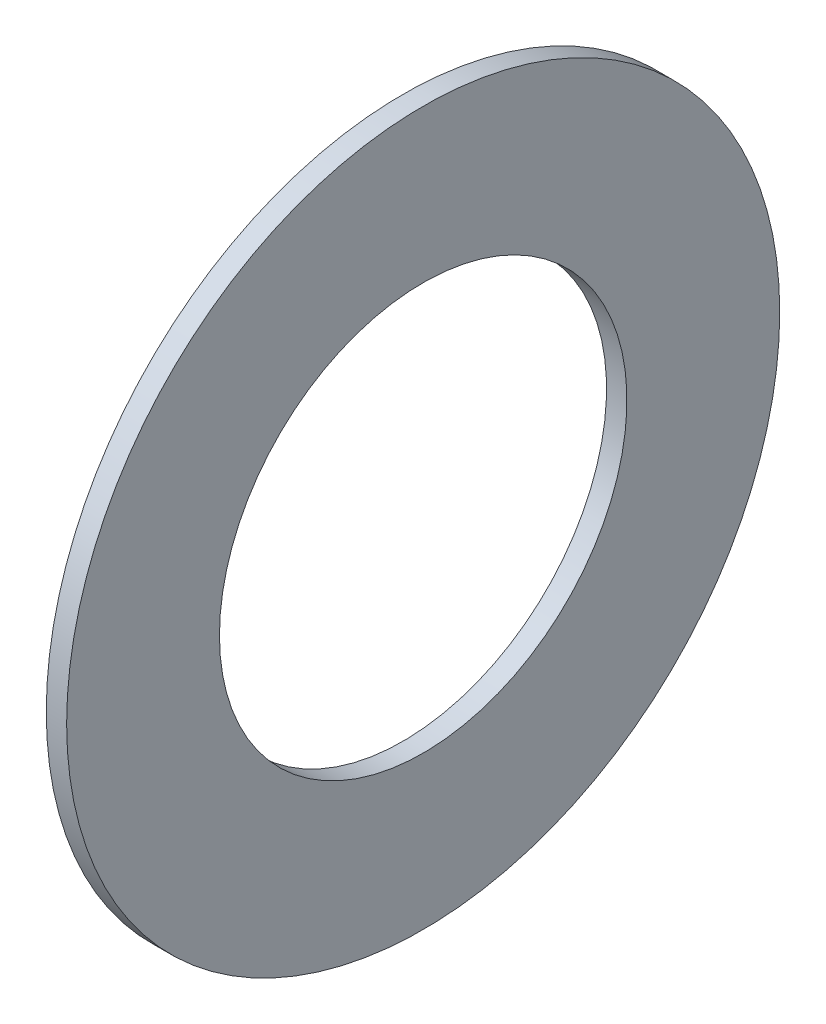
ISO-10303-21;
HEADER;
FILE_DESCRIPTION(('STEP AP214'),'2;1');
FILE_NAME('part.step','',(''),(''),'','','');
FILE_SCHEMA(('AUTOMOTIVE_DESIGN { 1 0 10303 214 1 1 1 1 }'));
ENDSEC;
DATA;
#1=APPLICATION_CONTEXT('core data for automotive mechanical design processes');
#2=APPLICATION_PROTOCOL_DEFINITION('international standard','automotive_design',2000,#1);
#3=PRODUCT_CONTEXT('',#1,'mechanical');
#4=PRODUCT('Part','Part','',(#3));
#5=PRODUCT_RELATED_PRODUCT_CATEGORY('part','',(#4));
#6=PRODUCT_DEFINITION_FORMATION('','',#4);
#7=PRODUCT_DEFINITION_CONTEXT('part definition',#1,'design');
#8=PRODUCT_DEFINITION('design','',#6,#7);
#9=PRODUCT_DEFINITION_SHAPE('','',#8);
#10=(LENGTH_UNIT() NAMED_UNIT(*) SI_UNIT(.MILLI.,.METRE.));
#11=(NAMED_UNIT(*) PLANE_ANGLE_UNIT() SI_UNIT($,.RADIAN.));
#12=(NAMED_UNIT(*) SI_UNIT($,.STERADIAN.) SOLID_ANGLE_UNIT());
#13=UNCERTAINTY_MEASURE_WITH_UNIT(LENGTH_MEASURE(1.E-05),#10,'distance_accuracy_value','');
#14=(GEOMETRIC_REPRESENTATION_CONTEXT(3) GLOBAL_UNCERTAINTY_ASSIGNED_CONTEXT((#13)) GLOBAL_UNIT_ASSIGNED_CONTEXT((#10,
#11,#12)) REPRESENTATION_CONTEXT('',''));
#15=CARTESIAN_POINT('',(0.,0.,0.));
#16=DIRECTION('',(0.,0.,1.));
#17=DIRECTION('',(1.,0.,0.));
#18=AXIS2_PLACEMENT_3D('',#15,#16,#17);
#19=CARTESIAN_POINT('',(-0.2,0.,0.));
#20=DIRECTION('',(-1.,0.,0.));
#21=DIRECTION('',(0.,0.,1.));
#22=AXIS2_PLACEMENT_3D('',#19,#20,#21);
#23=PLANE('',#22);
#24=CARTESIAN_POINT('',(-0.2,0.,0.));
#25=DIRECTION('',(-1.,0.,0.));
#26=DIRECTION('',(0.,0.,1.));
#27=AXIS2_PLACEMENT_3D('',#24,#25,#26);
#28=CIRCLE('',#27,2.);
#29=CARTESIAN_POINT('',(-0.2,0.,2.));
#30=VERTEX_POINT('',#29);
#31=EDGE_CURVE('E27',#30,#30,#28,.F.);
#32=ORIENTED_EDGE('',*,*,#31,.T.);
#33=EDGE_LOOP('',(#32));
#34=FACE_BOUND('',#33,.T.);
#35=CARTESIAN_POINT('',(-0.2,0.,0.));
#36=DIRECTION('',(1.,0.,0.));
#37=DIRECTION('',(0.,0.,-1.));
#38=AXIS2_PLACEMENT_3D('',#35,#36,#37);
#39=CIRCLE('',#38,3.5);
#40=CARTESIAN_POINT('',(-0.2,0.,-3.5));
#41=VERTEX_POINT('',#40);
#42=EDGE_CURVE('E18',#41,#41,#39,.T.);
#43=ORIENTED_EDGE('',*,*,#42,.F.);
#44=EDGE_LOOP('',(#43));
#45=FACE_BOUND('',#44,.T.);
#46=ADVANCED_FACE('F15',(#34,#45),#23,.T.);
#47=CARTESIAN_POINT('',(-0.2,0.,0.));
#48=DIRECTION('',(1.,0.,0.));
#49=DIRECTION('',(0.,0.,-1.));
#50=AXIS2_PLACEMENT_3D('',#47,#48,#49);
#51=CYLINDRICAL_SURFACE('',#50,3.5);
#52=ORIENTED_EDGE('',*,*,#42,.T.);
#53=EDGE_LOOP('',(#52));
#54=FACE_BOUND('',#53,.T.);
#55=CARTESIAN_POINT('',(0.,0.,0.));
#56=DIRECTION('',(1.,0.,0.));
#57=DIRECTION('',(0.,0.,-1.));
#58=AXIS2_PLACEMENT_3D('',#55,#56,#57);
#59=CIRCLE('',#58,3.5);
#60=CARTESIAN_POINT('',(0.,0.,-3.5));
#61=VERTEX_POINT('',#60);
#62=EDGE_CURVE('E22',#61,#61,#59,.F.);
#63=ORIENTED_EDGE('',*,*,#62,.T.);
#64=EDGE_LOOP('',(#63));
#65=FACE_BOUND('',#64,.T.);
#66=ADVANCED_FACE('F35',(#54,#65),#51,.T.);
#67=CARTESIAN_POINT('',(3.4,0.,0.));
#68=DIRECTION('',(-1.,0.,0.));
#69=DIRECTION('',(0.,0.,1.));
#70=AXIS2_PLACEMENT_3D('',#67,#68,#69);
#71=CYLINDRICAL_SURFACE('',#70,2.);
#72=CARTESIAN_POINT('',(0.,0.,0.));
#73=DIRECTION('',(-1.,0.,0.));
#74=DIRECTION('',(0.,0.,1.));
#75=AXIS2_PLACEMENT_3D('',#72,#73,#74);
#76=CIRCLE('',#75,2.);
#77=CARTESIAN_POINT('',(0.,0.,2.));
#78=VERTEX_POINT('',#77);
#79=EDGE_CURVE('E9',#78,#78,#76,.F.);
#80=ORIENTED_EDGE('',*,*,#79,.T.);
#81=EDGE_LOOP('',(#80));
#82=FACE_BOUND('',#81,.T.);
#83=ORIENTED_EDGE('',*,*,#31,.F.);
#84=EDGE_LOOP('',(#83));
#85=FACE_BOUND('',#84,.T.);
#86=ADVANCED_FACE('F42',(#82,#85),#71,.F.);
#87=CARTESIAN_POINT('',(0.,0.,0.));
#88=DIRECTION('',(-1.,0.,0.));
#89=DIRECTION('',(0.,0.,1.));
#90=AXIS2_PLACEMENT_3D('',#87,#88,#89);
#91=PLANE('',#90);
#92=ORIENTED_EDGE('',*,*,#79,.F.);
#93=EDGE_LOOP('',(#92));
#94=FACE_BOUND('',#93,.T.);
#95=ORIENTED_EDGE('',*,*,#62,.F.);
#96=EDGE_LOOP('',(#95));
#97=FACE_BOUND('',#96,.T.);
#98=ADVANCED_FACE('F43',(#94,#97),#91,.F.);
#99=CLOSED_SHELL('',(#46,#66,#86,#98));
#100=MANIFOLD_SOLID_BREP('B1',#99);
#101=ADVANCED_BREP_SHAPE_REPRESENTATION('',(#18,#100),#14);
#102=SHAPE_DEFINITION_REPRESENTATION(#9,#101);
ENDSEC;
END-ISO-10303-21;
